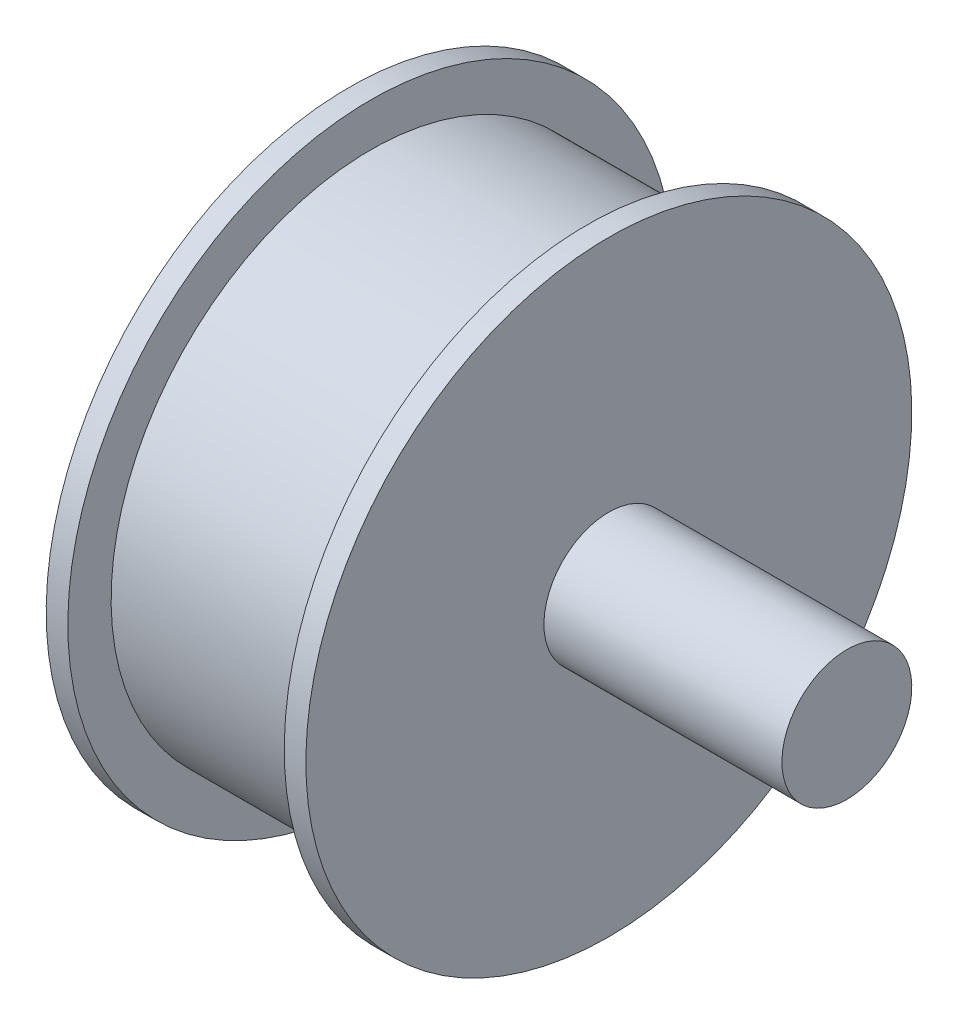
ISO-10303-21;
HEADER;
FILE_DESCRIPTION(('STEP AP214'),'2;1');
FILE_NAME('part.step','',(''),(''),'','','');
FILE_SCHEMA(('AUTOMOTIVE_DESIGN { 1 0 10303 214 1 1 1 1 }'));
ENDSEC;
DATA;
#1=APPLICATION_CONTEXT('core data for automotive mechanical design processes');
#2=APPLICATION_PROTOCOL_DEFINITION('international standard','automotive_design',2000,#1);
#3=PRODUCT_CONTEXT('',#1,'mechanical');
#4=PRODUCT('Part','Part','',(#3));
#5=PRODUCT_RELATED_PRODUCT_CATEGORY('part','',(#4));
#6=PRODUCT_DEFINITION_FORMATION('','',#4);
#7=PRODUCT_DEFINITION_CONTEXT('part definition',#1,'design');
#8=PRODUCT_DEFINITION('design','',#6,#7);
#9=PRODUCT_DEFINITION_SHAPE('','',#8);
#10=(LENGTH_UNIT() NAMED_UNIT(*) SI_UNIT(.MILLI.,.METRE.));
#11=(NAMED_UNIT(*) PLANE_ANGLE_UNIT() SI_UNIT($,.RADIAN.));
#12=(NAMED_UNIT(*) SI_UNIT($,.STERADIAN.) SOLID_ANGLE_UNIT());
#13=UNCERTAINTY_MEASURE_WITH_UNIT(LENGTH_MEASURE(1.E-05),#10,'distance_accuracy_value','');
#14=(GEOMETRIC_REPRESENTATION_CONTEXT(3) GLOBAL_UNCERTAINTY_ASSIGNED_CONTEXT((#13)) GLOBAL_UNIT_ASSIGNED_CONTEXT((#10,
#11,#12)) REPRESENTATION_CONTEXT('',''));
#15=CARTESIAN_POINT('',(0.,0.,0.));
#16=DIRECTION('',(0.,0.,1.));
#17=DIRECTION('',(1.,0.,0.));
#18=AXIS2_PLACEMENT_3D('',#15,#16,#17);
#19=CARTESIAN_POINT('',(-27.5,0.,0.));
#20=DIRECTION('',(1.,0.,0.));
#21=DIRECTION('',(0.,1.,0.));
#22=AXIS2_PLACEMENT_3D('',#19,#20,#21);
#23=PLANE('',#22);
#24=CARTESIAN_POINT('',(-27.5,0.,0.));
#25=DIRECTION('',(-1.,0.,0.));
#26=DIRECTION('',(0.,-1.,0.));
#27=AXIS2_PLACEMENT_3D('',#24,#25,#26);
#28=CIRCLE('',#27,5.);
#29=CARTESIAN_POINT('',(-27.5,-5.,0.));
#30=VERTEX_POINT('',#29);
#31=EDGE_CURVE('E46',#30,#30,#28,.T.);
#32=ORIENTED_EDGE('',*,*,#31,.T.);
#33=EDGE_LOOP('',(#32));
#34=FACE_BOUND('',#33,.T.);
#35=ADVANCED_FACE('F35',(#34),#23,.F.);
#36=CARTESIAN_POINT('',(-27.5,0.,0.));
#37=DIRECTION('',(-1.,0.,0.));
#38=DIRECTION('',(0.,-1.,0.));
#39=AXIS2_PLACEMENT_3D('',#36,#37,#38);
#40=CYLINDRICAL_SURFACE('',#39,5.);
#41=ORIENTED_EDGE('',*,*,#31,.F.);
#42=EDGE_LOOP('',(#41));
#43=FACE_BOUND('',#42,.T.);
#44=CARTESIAN_POINT('',(-30.,0.,0.));
#45=DIRECTION('',(-1.,0.,0.));
#46=DIRECTION('',(0.,-1.,0.));
#47=AXIS2_PLACEMENT_3D('',#44,#45,#46);
#48=CIRCLE('',#47,5.);
#49=CARTESIAN_POINT('',(-30.,-5.,0.));
#50=VERTEX_POINT('',#49);
#51=EDGE_CURVE('E50',#50,#50,#48,.T.);
#52=ORIENTED_EDGE('',*,*,#51,.T.);
#53=EDGE_LOOP('',(#52));
#54=FACE_BOUND('',#53,.T.);
#55=ADVANCED_FACE('F103',(#43,#54),#40,.F.);
#56=CARTESIAN_POINT('',(-30.,10.,0.));
#57=DIRECTION('',(1.,0.,0.));
#58=DIRECTION('',(0.,1.,0.));
#59=AXIS2_PLACEMENT_3D('',#56,#57,#58);
#60=PLANE('',#59);
#61=CARTESIAN_POINT('',(-30.,0.,0.));
#62=DIRECTION('',(1.,0.,0.));
#63=DIRECTION('',(0.,1.,0.));
#64=AXIS2_PLACEMENT_3D('',#61,#62,#63);
#65=CIRCLE('',#64,9.);
#66=CARTESIAN_POINT('',(-30.,9.,0.));
#67=VERTEX_POINT('',#66);
#68=EDGE_CURVE('E42',#67,#67,#65,.F.);
#69=ORIENTED_EDGE('',*,*,#68,.T.);
#70=EDGE_LOOP('',(#69));
#71=FACE_BOUND('',#70,.T.);
#72=ORIENTED_EDGE('',*,*,#51,.F.);
#73=EDGE_LOOP('',(#72));
#74=FACE_BOUND('',#73,.T.);
#75=ADVANCED_FACE('F108',(#71,#74),#60,.F.);
#76=CARTESIAN_POINT('',(-27.5,0.,0.));
#77=DIRECTION('',(-1.,0.,0.));
#78=DIRECTION('',(0.,-1.,0.));
#79=AXIS2_PLACEMENT_3D('',#76,#77,#78);
#80=CYLINDRICAL_SURFACE('',#79,10.);
#81=CARTESIAN_POINT('',(-29.,0.,0.));
#82=DIRECTION('',(1.,0.,0.));
#83=DIRECTION('',(0.,1.,0.));
#84=AXIS2_PLACEMENT_3D('',#81,#82,#83);
#85=CIRCLE('',#84,10.);
#86=CARTESIAN_POINT('',(-29.,10.,0.));
#87=VERTEX_POINT('',#86);
#88=EDGE_CURVE('E10',#87,#87,#85,.T.);
#89=ORIENTED_EDGE('',*,*,#88,.T.);
#90=EDGE_LOOP('',(#89));
#91=FACE_BOUND('',#90,.T.);
#92=CARTESIAN_POINT('',(-25.,0.,0.));
#93=DIRECTION('',(-1.,0.,0.));
#94=DIRECTION('',(0.,-1.,0.));
#95=AXIS2_PLACEMENT_3D('',#92,#93,#94);
#96=CIRCLE('',#95,10.);
#97=CARTESIAN_POINT('',(-25.,-10.,0.));
#98=VERTEX_POINT('',#97);
#99=EDGE_CURVE('E55',#98,#98,#96,.T.);
#100=ORIENTED_EDGE('',*,*,#99,.T.);
#101=EDGE_LOOP('',(#100));
#102=FACE_BOUND('',#101,.T.);
#103=ADVANCED_FACE('F114',(#91,#102),#80,.T.);
#104=CARTESIAN_POINT('',(-25.,10.,0.));
#105=DIRECTION('',(1.,0.,0.));
#106=DIRECTION('',(0.,1.,0.));
#107=AXIS2_PLACEMENT_3D('',#104,#105,#106);
#108=PLANE('',#107);
#109=ORIENTED_EDGE('',*,*,#99,.F.);
#110=EDGE_LOOP('',(#109));
#111=FACE_BOUND('',#110,.T.);
#112=CARTESIAN_POINT('',(-25.,0.,0.));
#113=DIRECTION('',(-1.,0.,0.));
#114=DIRECTION('',(0.,-1.,0.));
#115=AXIS2_PLACEMENT_3D('',#112,#113,#114);
#116=CIRCLE('',#115,25.);
#117=CARTESIAN_POINT('',(-25.,-25.,0.));
#118=VERTEX_POINT('',#117);
#119=EDGE_CURVE('E58',#118,#118,#116,.T.);
#120=ORIENTED_EDGE('',*,*,#119,.T.);
#121=EDGE_LOOP('',(#120));
#122=FACE_BOUND('',#121,.T.);
#123=ADVANCED_FACE('F117',(#111,#122),#108,.F.);
#124=CARTESIAN_POINT('',(-27.5,0.,0.));
#125=DIRECTION('',(-1.,0.,0.));
#126=DIRECTION('',(0.,-1.,0.));
#127=AXIS2_PLACEMENT_3D('',#124,#125,#126);
#128=CYLINDRICAL_SURFACE('',#127,25.);
#129=ORIENTED_EDGE('',*,*,#119,.F.);
#130=EDGE_LOOP('',(#129));
#131=FACE_BOUND('',#130,.T.);
#132=CARTESIAN_POINT('',(-30.,0.,0.));
#133=DIRECTION('',(-1.,0.,0.));
#134=DIRECTION('',(0.,-1.,0.));
#135=AXIS2_PLACEMENT_3D('',#132,#133,#134);
#136=CIRCLE('',#135,25.);
#137=CARTESIAN_POINT('',(-30.,-25.,0.));
#138=VERTEX_POINT('',#137);
#139=EDGE_CURVE('E61',#138,#138,#136,.T.);
#140=ORIENTED_EDGE('',*,*,#139,.T.);
#141=EDGE_LOOP('',(#140));
#142=FACE_BOUND('',#141,.T.);
#143=ADVANCED_FACE('F120',(#131,#142),#128,.F.);
#144=CARTESIAN_POINT('',(-30.,35.,0.));
#145=DIRECTION('',(1.,0.,0.));
#146=DIRECTION('',(0.,1.,0.));
#147=AXIS2_PLACEMENT_3D('',#144,#145,#146);
#148=PLANE('',#147);
#149=ORIENTED_EDGE('',*,*,#139,.F.);
#150=EDGE_LOOP('',(#149));
#151=FACE_BOUND('',#150,.T.);
#152=CARTESIAN_POINT('',(-30.,0.,0.));
#153=DIRECTION('',(-1.,0.,0.));
#154=DIRECTION('',(0.,-1.,0.));
#155=AXIS2_PLACEMENT_3D('',#152,#153,#154);
#156=CIRCLE('',#155,35.);
#157=CARTESIAN_POINT('',(-30.,-35.,0.));
#158=VERTEX_POINT('',#157);
#159=EDGE_CURVE('E64',#158,#158,#156,.T.);
#160=ORIENTED_EDGE('',*,*,#159,.T.);
#161=EDGE_LOOP('',(#160));
#162=FACE_BOUND('',#161,.T.);
#163=ADVANCED_FACE('F124',(#151,#162),#148,.F.);
#164=CARTESIAN_POINT('',(-27.5,0.,0.));
#165=DIRECTION('',(-1.,0.,0.));
#166=DIRECTION('',(0.,-1.,0.));
#167=AXIS2_PLACEMENT_3D('',#164,#165,#166);
#168=CYLINDRICAL_SURFACE('',#167,35.);
#169=ORIENTED_EDGE('',*,*,#159,.F.);
#170=EDGE_LOOP('',(#169));
#171=FACE_BOUND('',#170,.T.);
#172=CARTESIAN_POINT('',(-27.5,0.,0.));
#173=DIRECTION('',(-1.,0.,0.));
#174=DIRECTION('',(0.,-1.,0.));
#175=AXIS2_PLACEMENT_3D('',#172,#173,#174);
#176=CIRCLE('',#175,35.);
#177=CARTESIAN_POINT('',(-27.5,-35.,0.));
#178=VERTEX_POINT('',#177);
#179=EDGE_CURVE('E67',#178,#178,#176,.T.);
#180=ORIENTED_EDGE('',*,*,#179,.T.);
#181=EDGE_LOOP('',(#180));
#182=FACE_BOUND('',#181,.T.);
#183=ADVANCED_FACE('F128',(#171,#182),#168,.T.);
#184=CARTESIAN_POINT('',(-27.5,30.,0.));
#185=DIRECTION('',(-1.,0.,0.));
#186=DIRECTION('',(0.,-1.,0.));
#187=AXIS2_PLACEMENT_3D('',#184,#185,#186);
#188=PLANE('',#187);
#189=ORIENTED_EDGE('',*,*,#179,.F.);
#190=EDGE_LOOP('',(#189));
#191=FACE_BOUND('',#190,.T.);
#192=CARTESIAN_POINT('',(-27.5,0.,0.));
#193=DIRECTION('',(-1.,0.,0.));
#194=DIRECTION('',(0.,-1.,0.));
#195=AXIS2_PLACEMENT_3D('',#192,#193,#194);
#196=CIRCLE('',#195,30.);
#197=CARTESIAN_POINT('',(-27.5,-30.,0.));
#198=VERTEX_POINT('',#197);
#199=EDGE_CURVE('E70',#198,#198,#196,.T.);
#200=ORIENTED_EDGE('',*,*,#199,.T.);
#201=EDGE_LOOP('',(#200));
#202=FACE_BOUND('',#201,.T.);
#203=ADVANCED_FACE('F132',(#191,#202),#188,.F.);
#204=CARTESIAN_POINT('',(-27.5,0.,0.));
#205=DIRECTION('',(-1.,0.,0.));
#206=DIRECTION('',(0.,-1.,0.));
#207=AXIS2_PLACEMENT_3D('',#204,#205,#206);
#208=CYLINDRICAL_SURFACE('',#207,30.);
#209=ORIENTED_EDGE('',*,*,#199,.F.);
#210=EDGE_LOOP('',(#209));
#211=FACE_BOUND('',#210,.T.);
#212=CARTESIAN_POINT('',(-2.49999999999999,0.,0.));
#213=DIRECTION('',(-1.,0.,0.));
#214=DIRECTION('',(0.,-1.,0.));
#215=AXIS2_PLACEMENT_3D('',#212,#213,#214);
#216=CIRCLE('',#215,30.);
#217=CARTESIAN_POINT('',(-2.49999999999999,-30.,0.));
#218=VERTEX_POINT('',#217);
#219=EDGE_CURVE('E73',#218,#218,#216,.T.);
#220=ORIENTED_EDGE('',*,*,#219,.T.);
#221=EDGE_LOOP('',(#220));
#222=FACE_BOUND('',#221,.T.);
#223=ADVANCED_FACE('F136',(#211,#222),#208,.T.);
#224=CARTESIAN_POINT('',(-2.5,35.,0.));
#225=DIRECTION('',(1.,0.,0.));
#226=DIRECTION('',(0.,1.,0.));
#227=AXIS2_PLACEMENT_3D('',#224,#225,#226);
#228=PLANE('',#227);
#229=ORIENTED_EDGE('',*,*,#219,.F.);
#230=EDGE_LOOP('',(#229));
#231=FACE_BOUND('',#230,.T.);
#232=CARTESIAN_POINT('',(-2.5,0.,0.));
#233=DIRECTION('',(-1.,0.,0.));
#234=DIRECTION('',(0.,-1.,0.));
#235=AXIS2_PLACEMENT_3D('',#232,#233,#234);
#236=CIRCLE('',#235,35.);
#237=CARTESIAN_POINT('',(-2.5,-35.,0.));
#238=VERTEX_POINT('',#237);
#239=EDGE_CURVE('E76',#238,#238,#236,.T.);
#240=ORIENTED_EDGE('',*,*,#239,.T.);
#241=EDGE_LOOP('',(#240));
#242=FACE_BOUND('',#241,.T.);
#243=ADVANCED_FACE('F140',(#231,#242),#228,.F.);
#244=CARTESIAN_POINT('',(-27.5,0.,0.));
#245=DIRECTION('',(-1.,0.,0.));
#246=DIRECTION('',(0.,-1.,0.));
#247=AXIS2_PLACEMENT_3D('',#244,#245,#246);
#248=CYLINDRICAL_SURFACE('',#247,35.);
#249=ORIENTED_EDGE('',*,*,#239,.F.);
#250=EDGE_LOOP('',(#249));
#251=FACE_BOUND('',#250,.T.);
#252=CARTESIAN_POINT('',(0.,0.,0.));
#253=DIRECTION('',(-1.,0.,0.));
#254=DIRECTION('',(0.,-1.,0.));
#255=AXIS2_PLACEMENT_3D('',#252,#253,#254);
#256=CIRCLE('',#255,35.);
#257=CARTESIAN_POINT('',(0.,-35.,0.));
#258=VERTEX_POINT('',#257);
#259=EDGE_CURVE('E79',#258,#258,#256,.T.);
#260=ORIENTED_EDGE('',*,*,#259,.T.);
#261=EDGE_LOOP('',(#260));
#262=FACE_BOUND('',#261,.T.);
#263=ADVANCED_FACE('F144',(#251,#262),#248,.T.);
#264=CARTESIAN_POINT('',(0.,7.49999999999999,0.));
#265=DIRECTION('',(-1.,0.,0.));
#266=DIRECTION('',(0.,-1.,0.));
#267=AXIS2_PLACEMENT_3D('',#264,#265,#266);
#268=PLANE('',#267);
#269=ORIENTED_EDGE('',*,*,#259,.F.);
#270=EDGE_LOOP('',(#269));
#271=FACE_BOUND('',#270,.T.);
#272=CARTESIAN_POINT('',(0.,0.,0.));
#273=DIRECTION('',(-1.,0.,0.));
#274=DIRECTION('',(0.,-1.,0.));
#275=AXIS2_PLACEMENT_3D('',#272,#273,#274);
#276=CIRCLE('',#275,7.49999999999999);
#277=CARTESIAN_POINT('',(0.,-7.49999999999999,0.));
#278=VERTEX_POINT('',#277);
#279=EDGE_CURVE('E82',#278,#278,#276,.T.);
#280=ORIENTED_EDGE('',*,*,#279,.T.);
#281=EDGE_LOOP('',(#280));
#282=FACE_BOUND('',#281,.T.);
#283=ADVANCED_FACE('F99',(#271,#282),#268,.F.);
#284=CARTESIAN_POINT('',(-27.5,0.,0.));
#285=DIRECTION('',(-1.,0.,0.));
#286=DIRECTION('',(0.,-1.,0.));
#287=AXIS2_PLACEMENT_3D('',#284,#285,#286);
#288=CYLINDRICAL_SURFACE('',#287,7.5);
#289=ORIENTED_EDGE('',*,*,#279,.F.);
#290=EDGE_LOOP('',(#289));
#291=FACE_BOUND('',#290,.T.);
#292=CARTESIAN_POINT('',(27.5,0.,0.));
#293=DIRECTION('',(-1.,0.,0.));
#294=DIRECTION('',(0.,-1.,0.));
#295=AXIS2_PLACEMENT_3D('',#292,#293,#294);
#296=CIRCLE('',#295,7.5);
#297=CARTESIAN_POINT('',(27.5,-7.5,0.));
#298=VERTEX_POINT('',#297);
#299=EDGE_CURVE('E85',#298,#298,#296,.T.);
#300=ORIENTED_EDGE('',*,*,#299,.T.);
#301=EDGE_LOOP('',(#300));
#302=FACE_BOUND('',#301,.T.);
#303=ADVANCED_FACE('F89',(#291,#302),#288,.T.);
#304=CARTESIAN_POINT('',(27.5,0.,0.));
#305=DIRECTION('',(-1.,0.,0.));
#306=DIRECTION('',(0.,-1.,0.));
#307=AXIS2_PLACEMENT_3D('',#304,#305,#306);
#308=PLANE('',#307);
#309=ORIENTED_EDGE('',*,*,#299,.F.);
#310=EDGE_LOOP('',(#309));
#311=FACE_BOUND('',#310,.T.);
#312=ADVANCED_FACE('F91',(#311),#308,.F.);
#313=CARTESIAN_POINT('',(-29.,0.,0.));
#314=DIRECTION('',(1.,0.,0.));
#315=DIRECTION('',(0.,1.,0.));
#316=AXIS2_PLACEMENT_3D('',#313,#314,#315);
#317=TOROIDAL_SURFACE('',#316,9.,1.);
#318=ORIENTED_EDGE('',*,*,#88,.F.);
#319=EDGE_LOOP('',(#318));
#320=FACE_BOUND('',#319,.T.);
#321=ORIENTED_EDGE('',*,*,#68,.F.);
#322=EDGE_LOOP('',(#321));
#323=FACE_BOUND('',#322,.T.);
#324=ADVANCED_FACE('F37',(#320,#323),#317,.T.);
#325=CLOSED_SHELL('',(#35,#55,#75,#103,#123,#143,#163,#183,#203,#223,#243,#263,#283,#303,#312,#324));
#326=MANIFOLD_SOLID_BREP('B2',#325);
#327=ADVANCED_BREP_SHAPE_REPRESENTATION('',(#18,#326),#14);
#328=SHAPE_DEFINITION_REPRESENTATION(#9,#327);
ENDSEC;
END-ISO-10303-21;
